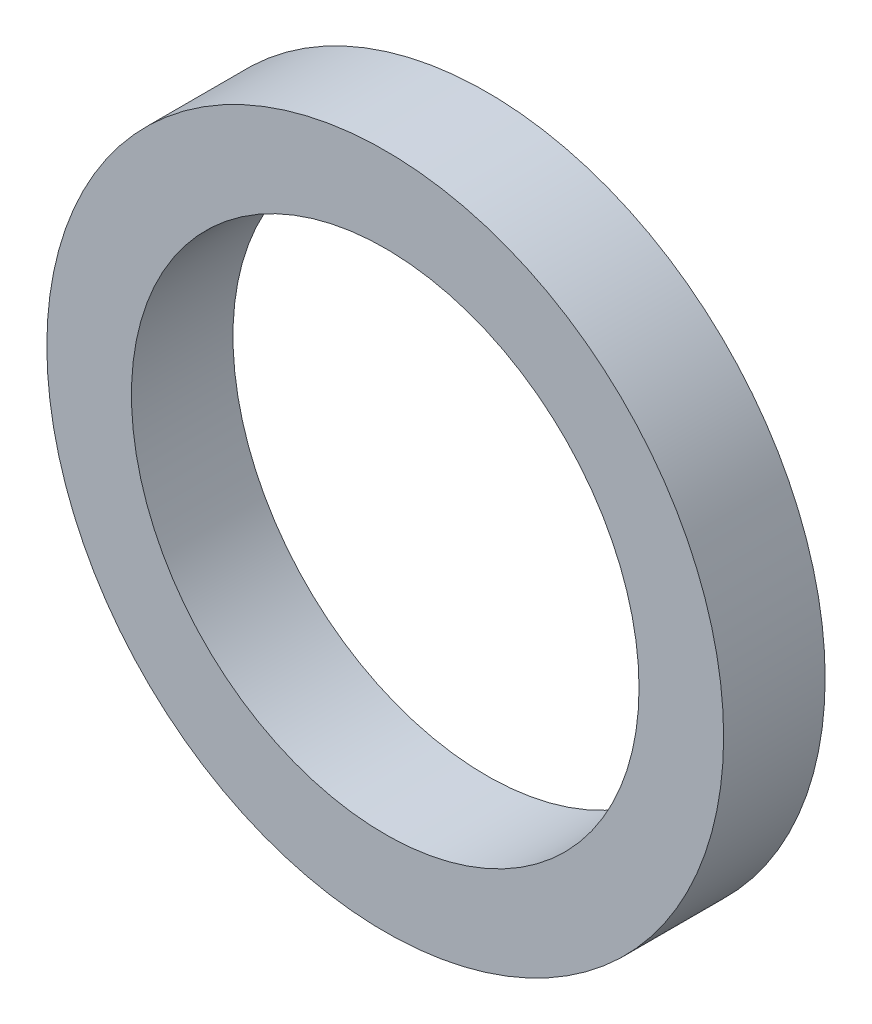
ISO-10303-21;
HEADER;
FILE_DESCRIPTION(('STEP AP214'),'2;1');
FILE_NAME('part.step','',(''),(''),'','','');
FILE_SCHEMA(('AUTOMOTIVE_DESIGN { 1 0 10303 214 1 1 1 1 }'));
ENDSEC;
DATA;
#1=APPLICATION_CONTEXT('core data for automotive mechanical design processes');
#2=APPLICATION_PROTOCOL_DEFINITION('international standard','automotive_design',2000,#1);
#3=PRODUCT_CONTEXT('',#1,'mechanical');
#4=PRODUCT('Part','Part','',(#3));
#5=PRODUCT_RELATED_PRODUCT_CATEGORY('part','',(#4));
#6=PRODUCT_DEFINITION_FORMATION('','',#4);
#7=PRODUCT_DEFINITION_CONTEXT('part definition',#1,'design');
#8=PRODUCT_DEFINITION('design','',#6,#7);
#9=PRODUCT_DEFINITION_SHAPE('','',#8);
#10=(LENGTH_UNIT() NAMED_UNIT(*) SI_UNIT(.MILLI.,.METRE.));
#11=(NAMED_UNIT(*) PLANE_ANGLE_UNIT() SI_UNIT($,.RADIAN.));
#12=(NAMED_UNIT(*) SI_UNIT($,.STERADIAN.) SOLID_ANGLE_UNIT());
#13=UNCERTAINTY_MEASURE_WITH_UNIT(LENGTH_MEASURE(1.E-05),#10,'distance_accuracy_value','');
#14=(GEOMETRIC_REPRESENTATION_CONTEXT(3) GLOBAL_UNCERTAINTY_ASSIGNED_CONTEXT((#13)) GLOBAL_UNIT_ASSIGNED_CONTEXT((#10,
#11,#12)) REPRESENTATION_CONTEXT('',''));
#15=CARTESIAN_POINT('',(0.,0.,0.));
#16=DIRECTION('',(0.,0.,1.));
#17=DIRECTION('',(1.,0.,0.));
#18=AXIS2_PLACEMENT_3D('',#15,#16,#17);
#19=CARTESIAN_POINT('',(0.,0.,30.));
#20=DIRECTION('',(0.,0.,1.));
#21=DIRECTION('',(1.,0.,0.));
#22=AXIS2_PLACEMENT_3D('',#19,#20,#21);
#23=PLANE('',#22);
#24=CARTESIAN_POINT('',(0.,0.,30.));
#25=DIRECTION('',(0.,0.,1.));
#26=DIRECTION('',(1.,0.,0.));
#27=AXIS2_PLACEMENT_3D('',#24,#25,#26);
#28=CIRCLE('',#27,100.);
#29=CARTESIAN_POINT('',(100.,0.,30.));
#30=VERTEX_POINT('',#29);
#31=EDGE_CURVE('E10',#30,#30,#28,.T.);
#32=ORIENTED_EDGE('',*,*,#31,.T.);
#33=EDGE_LOOP('',(#32));
#34=FACE_BOUND('',#33,.T.);
#35=CARTESIAN_POINT('',(0.,0.,30.));
#36=DIRECTION('',(0.,0.,1.));
#37=DIRECTION('',(1.,0.,0.));
#38=AXIS2_PLACEMENT_3D('',#35,#36,#37);
#39=CIRCLE('',#38,75.);
#40=CARTESIAN_POINT('',(75.,0.,30.));
#41=VERTEX_POINT('',#40);
#42=EDGE_CURVE('E56',#41,#41,#39,.T.);
#43=ORIENTED_EDGE('',*,*,#42,.F.);
#44=EDGE_LOOP('',(#43));
#45=FACE_BOUND('',#44,.T.);
#46=ADVANCED_FACE('F43',(#34,#45),#23,.T.);
#47=CARTESIAN_POINT('',(0.,0.,0.));
#48=DIRECTION('',(0.,0.,1.));
#49=DIRECTION('',(1.,0.,0.));
#50=AXIS2_PLACEMENT_3D('',#47,#48,#49);
#51=PLANE('',#50);
#52=CARTESIAN_POINT('',(0.,0.,0.));
#53=DIRECTION('',(0.,0.,1.));
#54=DIRECTION('',(1.,0.,0.));
#55=AXIS2_PLACEMENT_3D('',#52,#53,#54);
#56=CIRCLE('',#55,100.);
#57=CARTESIAN_POINT('',(100.,0.,0.));
#58=VERTEX_POINT('',#57);
#59=EDGE_CURVE('E47',#58,#58,#56,.T.);
#60=ORIENTED_EDGE('',*,*,#59,.F.);
#61=EDGE_LOOP('',(#60));
#62=FACE_BOUND('',#61,.T.);
#63=CARTESIAN_POINT('',(0.,0.,0.));
#64=DIRECTION('',(0.,0.,1.));
#65=DIRECTION('',(1.,0.,0.));
#66=AXIS2_PLACEMENT_3D('',#63,#64,#65);
#67=CIRCLE('',#66,75.);
#68=CARTESIAN_POINT('',(75.,0.,0.));
#69=VERTEX_POINT('',#68);
#70=EDGE_CURVE('E58',#69,#69,#67,.T.);
#71=ORIENTED_EDGE('',*,*,#70,.T.);
#72=EDGE_LOOP('',(#71));
#73=FACE_BOUND('',#72,.T.);
#74=ADVANCED_FACE('F70',(#62,#73),#51,.F.);
#75=CARTESIAN_POINT('',(0.,0.,30.));
#76=DIRECTION('',(0.,0.,-1.));
#77=DIRECTION('',(-1.,0.,0.));
#78=AXIS2_PLACEMENT_3D('',#75,#76,#77);
#79=CYLINDRICAL_SURFACE('',#78,100.);
#80=ORIENTED_EDGE('',*,*,#31,.F.);
#81=EDGE_LOOP('',(#80));
#82=FACE_BOUND('',#81,.T.);
#83=ORIENTED_EDGE('',*,*,#59,.T.);
#84=EDGE_LOOP('',(#83));
#85=FACE_BOUND('',#84,.T.);
#86=ADVANCED_FACE('F45',(#82,#85),#79,.T.);
#87=CARTESIAN_POINT('',(0.,0.,30.));
#88=DIRECTION('',(0.,0.,-1.));
#89=DIRECTION('',(-1.,0.,0.));
#90=AXIS2_PLACEMENT_3D('',#87,#88,#89);
#91=CYLINDRICAL_SURFACE('',#90,75.);
#92=ORIENTED_EDGE('',*,*,#42,.T.);
#93=EDGE_LOOP('',(#92));
#94=FACE_BOUND('',#93,.T.);
#95=ORIENTED_EDGE('',*,*,#70,.F.);
#96=EDGE_LOOP('',(#95));
#97=FACE_BOUND('',#96,.T.);
#98=ADVANCED_FACE('F66',(#94,#97),#91,.F.);
#99=CLOSED_SHELL('',(#46,#74,#86,#98));
#100=MANIFOLD_SOLID_BREP('B2',#99);
#101=ADVANCED_BREP_SHAPE_REPRESENTATION('',(#18,#100),#14);
#102=SHAPE_DEFINITION_REPRESENTATION(#9,#101);
ENDSEC;
END-ISO-10303-21;
